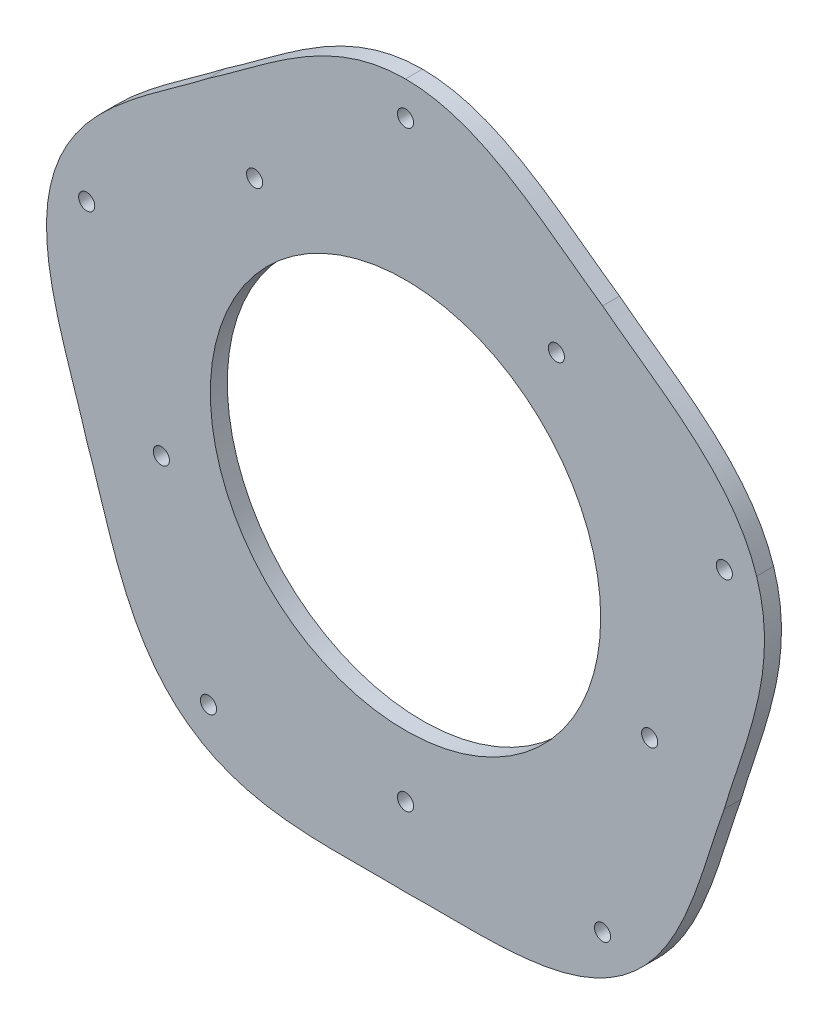
ISO-10303-21;
HEADER;
FILE_DESCRIPTION(('STEP AP214'),'2;1');
FILE_NAME('part.step','',(''),(''),'','','');
FILE_SCHEMA(('AUTOMOTIVE_DESIGN { 1 0 10303 214 1 1 1 1 }'));
ENDSEC;
DATA;
#1=APPLICATION_CONTEXT('core data for automotive mechanical design processes');
#2=APPLICATION_PROTOCOL_DEFINITION('international standard','automotive_design',2000,#1);
#3=PRODUCT_CONTEXT('',#1,'mechanical');
#4=PRODUCT('Part','Part','',(#3));
#5=PRODUCT_RELATED_PRODUCT_CATEGORY('part','',(#4));
#6=PRODUCT_DEFINITION_FORMATION('','',#4);
#7=PRODUCT_DEFINITION_CONTEXT('part definition',#1,'design');
#8=PRODUCT_DEFINITION('design','',#6,#7);
#9=PRODUCT_DEFINITION_SHAPE('','',#8);
#10=(LENGTH_UNIT() NAMED_UNIT(*) SI_UNIT(.MILLI.,.METRE.));
#11=(NAMED_UNIT(*) PLANE_ANGLE_UNIT() SI_UNIT($,.RADIAN.));
#12=(NAMED_UNIT(*) SI_UNIT($,.STERADIAN.) SOLID_ANGLE_UNIT());
#13=UNCERTAINTY_MEASURE_WITH_UNIT(LENGTH_MEASURE(1.E-05),#10,'distance_accuracy_value','');
#14=(GEOMETRIC_REPRESENTATION_CONTEXT(3) GLOBAL_UNCERTAINTY_ASSIGNED_CONTEXT((#13)) GLOBAL_UNIT_ASSIGNED_CONTEXT((#10,
#11,#12)) REPRESENTATION_CONTEXT('',''));
#15=CARTESIAN_POINT('',(0.,0.,0.));
#16=DIRECTION('',(0.,0.,1.));
#17=DIRECTION('',(1.,0.,0.));
#18=AXIS2_PLACEMENT_3D('',#15,#16,#17);
#19=CARTESIAN_POINT('',(0.,87.,4.));
#20=CARTESIAN_POINT('',(18.2248449755487,86.9986126487543,4.));
#21=CARTESIAN_POINT('',(32.2889028746179,73.5369026984063,4.));
#22=CARTESIAN_POINT('',(46.4350349311055,63.9123425556208,4.));
#23=B_SPLINE_CURVE_WITH_KNOTS('',3,(#19,#20,#21,#22),.UNSPECIFIED.,.F.,.F.,(4,4),(0.,1.),.UNSPECIFIED.);
#24=DIRECTION('',(0.,0.,-1.));
#25=VECTOR('',#24,1.);
#26=SURFACE_OF_LINEAR_EXTRUSION('',#23,#25);
#27=CARTESIAN_POINT('',(0.,87.,0.));
#28=CARTESIAN_POINT('',(18.2248449755487,86.9986126487543,0.));
#29=CARTESIAN_POINT('',(32.2889028746179,73.5369026984063,0.));
#30=CARTESIAN_POINT('',(46.4350349311055,63.9123425556208,0.));
#31=B_SPLINE_CURVE_WITH_KNOTS('',3,(#27,#28,#29,#30),.UNSPECIFIED.,.F.,.F.,(4,4),(0.,1.),.UNSPECIFIED.);
#32=CARTESIAN_POINT('',(0.,87.,0.));
#33=VERTEX_POINT('',#32);
#34=CARTESIAN_POINT('',(46.4350349311055,63.9123425556208,0.));
#35=VERTEX_POINT('',#34);
#36=EDGE_CURVE('E288',#33,#35,#31,.T.);
#37=ORIENTED_EDGE('',*,*,#36,.F.);
#38=DIRECTION('',(0.,0.,-1.));
#39=VECTOR('',#38,1.);
#40=CARTESIAN_POINT('',(0.,87.,4.));
#41=LINE('',#40,#39);
#42=CARTESIAN_POINT('',(0.,87.,4.));
#43=VERTEX_POINT('',#42);
#44=EDGE_CURVE('E11',#43,#33,#41,.T.);
#45=ORIENTED_EDGE('',*,*,#44,.F.);
#46=CARTESIAN_POINT('',(46.4350349311055,63.9123425556208,4.));
#47=VERTEX_POINT('',#46);
#48=EDGE_CURVE('E231',#43,#47,#23,.T.);
#49=ORIENTED_EDGE('',*,*,#48,.T.);
#50=DIRECTION('',(0.,0.,-1.));
#51=VECTOR('',#50,1.);
#52=CARTESIAN_POINT('',(46.4350349311055,63.9123425556208,4.));
#53=LINE('',#52,#51);
#54=EDGE_CURVE('E96',#47,#35,#53,.T.);
#55=ORIENTED_EDGE('',*,*,#54,.T.);
#56=EDGE_LOOP('',(#37,#45,#49,#55));
#57=FACE_BOUND('',#56,.T.);
#58=ADVANCED_FACE('F39',(#57),#26,.T.);
#59=CARTESIAN_POINT('',(1.24206200879939E-12,87.,4.));
#60=CARTESIAN_POINT('',(-18.2248449755474,86.9986126487545,4.));
#61=CARTESIAN_POINT('',(-32.2889028746169,73.5369026984067,4.));
#62=CARTESIAN_POINT('',(-46.4350349311046,63.9123425556215,4.));
#63=B_SPLINE_CURVE_WITH_KNOTS('',3,(#59,#60,#61,#62),.UNSPECIFIED.,.F.,.F.,(4,4),(0.,1.),.UNSPECIFIED.);
#64=DIRECTION('',(0.,0.,-1.));
#65=VECTOR('',#64,1.);
#66=SURFACE_OF_LINEAR_EXTRUSION('',#63,#65);
#67=CARTESIAN_POINT('',(1.24206200879939E-12,87.,0.));
#68=CARTESIAN_POINT('',(-18.2248449755474,86.9986126487545,0.));
#69=CARTESIAN_POINT('',(-32.2889028746169,73.5369026984067,0.));
#70=CARTESIAN_POINT('',(-46.4350349311046,63.9123425556215,0.));
#71=B_SPLINE_CURVE_WITH_KNOTS('',3,(#67,#68,#69,#70),.UNSPECIFIED.,.F.,.F.,(4,4),(0.,1.),.UNSPECIFIED.);
#72=CARTESIAN_POINT('',(-46.4350349311046,63.9123425556215,0.));
#73=VERTEX_POINT('',#72);
#74=EDGE_CURVE('E293',#33,#73,#71,.T.);
#75=ORIENTED_EDGE('',*,*,#74,.T.);
#76=DIRECTION('',(0.,0.,-1.));
#77=VECTOR('',#76,1.);
#78=CARTESIAN_POINT('',(-46.4350349311046,63.9123425556215,4.));
#79=LINE('',#78,#77);
#80=CARTESIAN_POINT('',(-46.4350349311046,63.9123425556215,4.));
#81=VERTEX_POINT('',#80);
#82=EDGE_CURVE('E48',#81,#73,#79,.T.);
#83=ORIENTED_EDGE('',*,*,#82,.F.);
#84=EDGE_CURVE('E223',#43,#81,#63,.T.);
#85=ORIENTED_EDGE('',*,*,#84,.F.);
#86=ORIENTED_EDGE('',*,*,#44,.T.);
#87=EDGE_LOOP('',(#75,#83,#85,#86));
#88=FACE_BOUND('',#87,.T.);
#89=ADVANCED_FACE('F214',(#88),#66,.F.);
#90=CARTESIAN_POINT('',(-82.7419169176781,26.8844785106214,4.));
#91=CARTESIAN_POINT('',(-77.1088106509418,44.2169073679737,4.));
#92=CARTESIAN_POINT('',(-59.9599307815023,53.4327241304319,4.));
#93=CARTESIAN_POINT('',(-46.4350349311046,63.9123425556215,4.));
#94=B_SPLINE_CURVE_WITH_KNOTS('',3,(#90,#91,#92,#93),.UNSPECIFIED.,.F.,.F.,(4,4),(0.,1.),.UNSPECIFIED.);
#95=DIRECTION('',(0.,0.,-1.));
#96=VECTOR('',#95,1.);
#97=SURFACE_OF_LINEAR_EXTRUSION('',#94,#96);
#98=CARTESIAN_POINT('',(-82.7419169176781,26.8844785106214,0.));
#99=CARTESIAN_POINT('',(-77.1088106509418,44.2169073679737,0.));
#100=CARTESIAN_POINT('',(-59.9599307815023,53.4327241304319,0.));
#101=CARTESIAN_POINT('',(-46.4350349311046,63.9123425556215,0.));
#102=B_SPLINE_CURVE_WITH_KNOTS('',3,(#98,#99,#100,#101),.UNSPECIFIED.,.F.,.F.,(4,4),(0.,1.),.UNSPECIFIED.);
#103=CARTESIAN_POINT('',(-82.7419169176781,26.8844785106214,0.));
#104=VERTEX_POINT('',#103);
#105=EDGE_CURVE('E301',#104,#73,#102,.T.);
#106=ORIENTED_EDGE('',*,*,#105,.F.);
#107=DIRECTION('',(0.,0.,-1.));
#108=VECTOR('',#107,1.);
#109=CARTESIAN_POINT('',(-82.7419169176781,26.8844785106214,4.));
#110=LINE('',#109,#108);
#111=CARTESIAN_POINT('',(-82.7419169176781,26.8844785106214,4.));
#112=VERTEX_POINT('',#111);
#113=EDGE_CURVE('E393',#112,#104,#110,.T.);
#114=ORIENTED_EDGE('',*,*,#113,.F.);
#115=EDGE_CURVE('E218',#112,#81,#94,.T.);
#116=ORIENTED_EDGE('',*,*,#115,.T.);
#117=ORIENTED_EDGE('',*,*,#82,.T.);
#118=EDGE_LOOP('',(#106,#114,#116,#117));
#119=FACE_BOUND('',#118,.T.);
#120=ADVANCED_FACE('F210',(#119),#97,.T.);
#121=CARTESIAN_POINT('',(-82.7419169176781,26.8844785106214,4.));
#122=CARTESIAN_POINT('',(-88.372384285529,9.55119222304482,4.));
#123=CARTESIAN_POINT('',(-79.915570217461,-7.9844188354213,4.));
#124=CARTESIAN_POINT('',(-75.1334647873174,-24.4123425556201,4.));
#125=B_SPLINE_CURVE_WITH_KNOTS('',3,(#121,#122,#123,#124),.UNSPECIFIED.,.F.,.F.,(4,4),(0.,1.),.UNSPECIFIED.);
#126=DIRECTION('',(0.,0.,-1.));
#127=VECTOR('',#126,1.);
#128=SURFACE_OF_LINEAR_EXTRUSION('',#125,#127);
#129=CARTESIAN_POINT('',(-82.7419169176781,26.8844785106214,0.));
#130=CARTESIAN_POINT('',(-88.372384285529,9.55119222304482,0.));
#131=CARTESIAN_POINT('',(-79.915570217461,-7.9844188354213,0.));
#132=CARTESIAN_POINT('',(-75.1334647873174,-24.4123425556201,0.));
#133=B_SPLINE_CURVE_WITH_KNOTS('',3,(#129,#130,#131,#132),.UNSPECIFIED.,.F.,.F.,(4,4),(0.,1.),.UNSPECIFIED.);
#134=CARTESIAN_POINT('',(-75.1334647873174,-24.4123425556201,0.));
#135=VERTEX_POINT('',#134);
#136=EDGE_CURVE('E309',#104,#135,#133,.T.);
#137=ORIENTED_EDGE('',*,*,#136,.T.);
#138=DIRECTION('',(0.,0.,-1.));
#139=VECTOR('',#138,1.);
#140=CARTESIAN_POINT('',(-75.1334647873174,-24.4123425556201,4.));
#141=LINE('',#140,#139);
#142=CARTESIAN_POINT('',(-75.1334647873174,-24.4123425556201,4.));
#143=VERTEX_POINT('',#142);
#144=EDGE_CURVE('E391',#143,#135,#141,.T.);
#145=ORIENTED_EDGE('',*,*,#144,.F.);
#146=EDGE_CURVE('E195',#112,#143,#125,.T.);
#147=ORIENTED_EDGE('',*,*,#146,.F.);
#148=ORIENTED_EDGE('',*,*,#113,.T.);
#149=EDGE_LOOP('',(#137,#145,#147,#148));
#150=FACE_BOUND('',#149,.T.);
#151=ADVANCED_FACE('F206',(#150),#128,.F.);
#152=CARTESIAN_POINT('',(-51.1373169494458,-70.38447851062,4.));
#153=CARTESIAN_POINT('',(-65.8807107899114,-59.6710610179408,4.));
#154=CARTESIAN_POINT('',(-69.3461780606782,-40.5136630743026,4.));
#155=CARTESIAN_POINT('',(-75.1334647873174,-24.4123425556201,4.));
#156=B_SPLINE_CURVE_WITH_KNOTS('',3,(#152,#153,#154,#155),.UNSPECIFIED.,.F.,.F.,(4,4),(0.,1.),.UNSPECIFIED.);
#157=DIRECTION('',(0.,0.,-1.));
#158=VECTOR('',#157,1.);
#159=SURFACE_OF_LINEAR_EXTRUSION('',#156,#158);
#160=CARTESIAN_POINT('',(-51.1373169494458,-70.38447851062,0.));
#161=CARTESIAN_POINT('',(-65.8807107899114,-59.6710610179408,0.));
#162=CARTESIAN_POINT('',(-69.3461780606782,-40.5136630743026,0.));
#163=CARTESIAN_POINT('',(-75.1334647873174,-24.4123425556201,0.));
#164=B_SPLINE_CURVE_WITH_KNOTS('',3,(#160,#161,#162,#163),.UNSPECIFIED.,.F.,.F.,(4,4),(0.,1.),.UNSPECIFIED.);
#165=CARTESIAN_POINT('',(-51.1373169494458,-70.38447851062,0.));
#166=VERTEX_POINT('',#165);
#167=EDGE_CURVE('E317',#166,#135,#164,.T.);
#168=ORIENTED_EDGE('',*,*,#167,.F.);
#169=DIRECTION('',(0.,0.,-1.));
#170=VECTOR('',#169,1.);
#171=CARTESIAN_POINT('',(-51.1373169494458,-70.38447851062,4.));
#172=LINE('',#171,#170);
#173=CARTESIAN_POINT('',(-51.1373169494458,-70.38447851062,4.));
#174=VERTEX_POINT('',#173);
#175=EDGE_CURVE('E389',#174,#166,#172,.T.);
#176=ORIENTED_EDGE('',*,*,#175,.F.);
#177=EDGE_CURVE('E186',#174,#143,#156,.T.);
#178=ORIENTED_EDGE('',*,*,#177,.T.);
#179=ORIENTED_EDGE('',*,*,#144,.T.);
#180=EDGE_LOOP('',(#168,#176,#178,#179));
#181=FACE_BOUND('',#180,.T.);
#182=ADVANCED_FACE('F203',(#181),#159,.T.);
#183=CARTESIAN_POINT('',(-51.1373169494458,-70.38447851062,4.));
#184=CARTESIAN_POINT('',(-36.3922921797762,-81.0956512218293,4.));
#185=CARTESIAN_POINT('',(-17.1016357501025,-78.4715449191119,4.));
#186=CARTESIAN_POINT('',(-5.68989300120393E-13,-79.,4.));
#187=B_SPLINE_CURVE_WITH_KNOTS('',3,(#183,#184,#185,#186),.UNSPECIFIED.,.F.,.F.,(4,4),(0.,1.),.UNSPECIFIED.);
#188=DIRECTION('',(0.,0.,-1.));
#189=VECTOR('',#188,1.);
#190=SURFACE_OF_LINEAR_EXTRUSION('',#187,#189);
#191=CARTESIAN_POINT('',(-51.1373169494458,-70.38447851062,0.));
#192=CARTESIAN_POINT('',(-36.3922921797762,-81.0956512218293,0.));
#193=CARTESIAN_POINT('',(-17.1016357501025,-78.4715449191119,0.));
#194=CARTESIAN_POINT('',(-5.68989300120393E-13,-79.,0.));
#195=B_SPLINE_CURVE_WITH_KNOTS('',3,(#191,#192,#193,#194),.UNSPECIFIED.,.F.,.F.,(4,4),(0.,1.),.UNSPECIFIED.);
#196=CARTESIAN_POINT('',(-5.68989300120393E-13,-79.,0.));
#197=VERTEX_POINT('',#196);
#198=EDGE_CURVE('E325',#166,#197,#195,.T.);
#199=ORIENTED_EDGE('',*,*,#198,.T.);
#200=DIRECTION('',(0.,0.,-1.));
#201=VECTOR('',#200,1.);
#202=CARTESIAN_POINT('',(-5.68989300120393E-13,-79.,4.));
#203=LINE('',#202,#201);
#204=CARTESIAN_POINT('',(-5.68989300120393E-13,-79.,4.));
#205=VERTEX_POINT('',#204);
#206=EDGE_CURVE('E387',#205,#197,#203,.T.);
#207=ORIENTED_EDGE('',*,*,#206,.F.);
#208=EDGE_CURVE('E178',#174,#205,#187,.T.);
#209=ORIENTED_EDGE('',*,*,#208,.F.);
#210=ORIENTED_EDGE('',*,*,#175,.T.);
#211=EDGE_LOOP('',(#199,#207,#209,#210));
#212=FACE_BOUND('',#211,.T.);
#213=ADVANCED_FACE('F171',(#212),#190,.F.);
#214=CARTESIAN_POINT('',(51.1373169494448,-70.3844785106207,4.));
#215=CARTESIAN_POINT('',(36.392292179775,-81.0956512218298,4.));
#216=CARTESIAN_POINT('',(17.1016357501013,-78.4715449191122,4.));
#217=CARTESIAN_POINT('',(-5.68989300120393E-13,-79.,4.));
#218=B_SPLINE_CURVE_WITH_KNOTS('',3,(#214,#215,#216,#217),.UNSPECIFIED.,.F.,.F.,(4,4),(0.,1.),.UNSPECIFIED.);
#219=DIRECTION('',(0.,0.,-1.));
#220=VECTOR('',#219,1.);
#221=SURFACE_OF_LINEAR_EXTRUSION('',#218,#220);
#222=CARTESIAN_POINT('',(51.1373169494448,-70.3844785106207,0.));
#223=CARTESIAN_POINT('',(36.392292179775,-81.0956512218298,0.));
#224=CARTESIAN_POINT('',(17.1016357501013,-78.4715449191122,0.));
#225=CARTESIAN_POINT('',(-5.68989300120393E-13,-79.,0.));
#226=B_SPLINE_CURVE_WITH_KNOTS('',3,(#222,#223,#224,#225),.UNSPECIFIED.,.F.,.F.,(4,4),(0.,1.),.UNSPECIFIED.);
#227=CARTESIAN_POINT('',(51.1373169494448,-70.3844785106207,0.));
#228=VERTEX_POINT('',#227);
#229=EDGE_CURVE('E333',#228,#197,#226,.T.);
#230=ORIENTED_EDGE('',*,*,#229,.F.);
#231=DIRECTION('',(0.,0.,-1.));
#232=VECTOR('',#231,1.);
#233=CARTESIAN_POINT('',(51.1373169494448,-70.3844785106207,4.));
#234=LINE('',#233,#232);
#235=CARTESIAN_POINT('',(51.1373169494448,-70.3844785106207,4.));
#236=VERTEX_POINT('',#235);
#237=EDGE_CURVE('E139',#236,#228,#234,.T.);
#238=ORIENTED_EDGE('',*,*,#237,.F.);
#239=EDGE_CURVE('E128',#236,#205,#218,.T.);
#240=ORIENTED_EDGE('',*,*,#239,.T.);
#241=ORIENTED_EDGE('',*,*,#206,.T.);
#242=EDGE_LOOP('',(#230,#238,#240,#241));
#243=FACE_BOUND('',#242,.T.);
#244=ADVANCED_FACE('F168',(#243),#221,.T.);
#245=CARTESIAN_POINT('',(51.1373169494448,-70.3844785106207,4.));
#246=CARTESIAN_POINT('',(65.8807107899106,-59.6710610179418,4.));
#247=CARTESIAN_POINT('',(69.3461780606775,-40.5136630743036,4.));
#248=CARTESIAN_POINT('',(75.1334647873171,-24.4123425556212,4.));
#249=B_SPLINE_CURVE_WITH_KNOTS('',3,(#245,#246,#247,#248),.UNSPECIFIED.,.F.,.F.,(4,4),(0.,1.),.UNSPECIFIED.);
#250=DIRECTION('',(0.,0.,-1.));
#251=VECTOR('',#250,1.);
#252=SURFACE_OF_LINEAR_EXTRUSION('',#249,#251);
#253=CARTESIAN_POINT('',(51.1373169494448,-70.3844785106207,0.));
#254=CARTESIAN_POINT('',(65.8807107899106,-59.6710610179418,0.));
#255=CARTESIAN_POINT('',(69.3461780606775,-40.5136630743036,0.));
#256=CARTESIAN_POINT('',(75.1334647873171,-24.4123425556212,0.));
#257=B_SPLINE_CURVE_WITH_KNOTS('',3,(#253,#254,#255,#256),.UNSPECIFIED.,.F.,.F.,(4,4),(0.,1.),.UNSPECIFIED.);
#258=CARTESIAN_POINT('',(75.1334647873171,-24.4123425556212,0.));
#259=VERTEX_POINT('',#258);
#260=EDGE_CURVE('E135',#228,#259,#257,.T.);
#261=ORIENTED_EDGE('',*,*,#260,.T.);
#262=DIRECTION('',(0.,0.,-1.));
#263=VECTOR('',#262,1.);
#264=CARTESIAN_POINT('',(75.1334647873171,-24.4123425556212,4.));
#265=LINE('',#264,#263);
#266=CARTESIAN_POINT('',(75.1334647873171,-24.4123425556212,4.));
#267=VERTEX_POINT('',#266);
#268=EDGE_CURVE('E132',#267,#259,#265,.T.);
#269=ORIENTED_EDGE('',*,*,#268,.F.);
#270=EDGE_CURVE('E121',#236,#267,#249,.T.);
#271=ORIENTED_EDGE('',*,*,#270,.F.);
#272=ORIENTED_EDGE('',*,*,#237,.T.);
#273=EDGE_LOOP('',(#261,#269,#271,#272));
#274=FACE_BOUND('',#273,.T.);
#275=ADVANCED_FACE('F133',(#274),#252,.F.);
#276=CARTESIAN_POINT('',(82.7419169176785,26.8844785106202,4.));
#277=CARTESIAN_POINT('',(88.3723842855293,9.55119222304353,4.));
#278=CARTESIAN_POINT('',(79.915570217461,-7.98441883542246,4.));
#279=CARTESIAN_POINT('',(75.1334647873171,-24.4123425556212,4.));
#280=B_SPLINE_CURVE_WITH_KNOTS('',3,(#276,#277,#278,#279),.UNSPECIFIED.,.F.,.F.,(4,4),(0.,1.),.UNSPECIFIED.);
#281=DIRECTION('',(0.,0.,-1.));
#282=VECTOR('',#281,1.);
#283=SURFACE_OF_LINEAR_EXTRUSION('',#280,#282);
#284=CARTESIAN_POINT('',(82.7419169176785,26.8844785106202,0.));
#285=CARTESIAN_POINT('',(88.3723842855293,9.55119222304353,0.));
#286=CARTESIAN_POINT('',(79.915570217461,-7.98441883542246,0.));
#287=CARTESIAN_POINT('',(75.1334647873171,-24.4123425556212,0.));
#288=B_SPLINE_CURVE_WITH_KNOTS('',3,(#284,#285,#286,#287),.UNSPECIFIED.,.F.,.F.,(4,4),(0.,1.),.UNSPECIFIED.);
#289=CARTESIAN_POINT('',(82.7419169176785,26.8844785106202,0.));
#290=VERTEX_POINT('',#289);
#291=EDGE_CURVE('E347',#290,#259,#288,.T.);
#292=ORIENTED_EDGE('',*,*,#291,.F.);
#293=DIRECTION('',(0.,0.,-1.));
#294=VECTOR('',#293,1.);
#295=CARTESIAN_POINT('',(82.7419169176785,26.8844785106202,4.));
#296=LINE('',#295,#294);
#297=CARTESIAN_POINT('',(82.7419169176785,26.8844785106202,4.));
#298=VERTEX_POINT('',#297);
#299=EDGE_CURVE('E89',#298,#290,#296,.T.);
#300=ORIENTED_EDGE('',*,*,#299,.F.);
#301=EDGE_CURVE('E126',#298,#267,#280,.T.);
#302=ORIENTED_EDGE('',*,*,#301,.T.);
#303=ORIENTED_EDGE('',*,*,#268,.T.);
#304=EDGE_LOOP('',(#292,#300,#302,#303));
#305=FACE_BOUND('',#304,.T.);
#306=ADVANCED_FACE('F141',(#305),#283,.T.);
#307=CARTESIAN_POINT('',(35.5610077636947,48.9455281596843,4.));
#308=DIRECTION('',(0.,0.,-1.));
#309=DIRECTION('',(-1.,0.,0.));
#310=AXIS2_PLACEMENT_3D('',#307,#308,#309);
#311=CYLINDRICAL_SURFACE('',#310,1.9);
#312=CARTESIAN_POINT('',(35.5610077636947,48.9455281596843,4.));
#313=DIRECTION('',(0.,0.,1.));
#314=DIRECTION('',(1.,0.,0.));
#315=AXIS2_PLACEMENT_3D('',#312,#313,#314);
#316=CIRCLE('',#315,1.9);
#317=CARTESIAN_POINT('',(37.4610077636947,48.9455281596843,4.));
#318=VERTEX_POINT('',#317);
#319=EDGE_CURVE('E626',#318,#318,#316,.T.);
#320=ORIENTED_EDGE('',*,*,#319,.T.);
#321=EDGE_LOOP('',(#320));
#322=FACE_BOUND('',#321,.T.);
#323=CARTESIAN_POINT('',(35.5610077636947,48.9455281596843,0.));
#324=DIRECTION('',(0.,0.,1.));
#325=DIRECTION('',(1.,0.,0.));
#326=AXIS2_PLACEMENT_3D('',#323,#324,#325);
#327=CIRCLE('',#326,1.9);
#328=CARTESIAN_POINT('',(37.4610077636947,48.9455281596843,0.));
#329=VERTEX_POINT('',#328);
#330=EDGE_CURVE('E376',#329,#329,#327,.T.);
#331=ORIENTED_EDGE('',*,*,#330,.F.);
#332=EDGE_LOOP('',(#331));
#333=FACE_BOUND('',#332,.T.);
#334=ADVANCED_FACE('F163',(#322,#333),#311,.F.);
#335=CARTESIAN_POINT('',(57.538919235858,-18.6955281596827,4.));
#336=DIRECTION('',(0.,0.,-1.));
#337=DIRECTION('',(-1.,0.,0.));
#338=AXIS2_PLACEMENT_3D('',#335,#336,#337);
#339=CYLINDRICAL_SURFACE('',#338,1.90000000000002);
#340=CARTESIAN_POINT('',(57.538919235858,-18.6955281596827,4.));
#341=DIRECTION('',(0.,0.,1.));
#342=DIRECTION('',(1.,0.,0.));
#343=AXIS2_PLACEMENT_3D('',#340,#341,#342);
#344=CIRCLE('',#343,1.90000000000002);
#345=CARTESIAN_POINT('',(59.438919235858,-18.6955281596827,4.));
#346=VERTEX_POINT('',#345);
#347=EDGE_CURVE('E628',#346,#346,#344,.T.);
#348=ORIENTED_EDGE('',*,*,#347,.T.);
#349=EDGE_LOOP('',(#348));
#350=FACE_BOUND('',#349,.T.);
#351=CARTESIAN_POINT('',(57.538919235858,-18.6955281596827,0.));
#352=DIRECTION('',(0.,0.,1.));
#353=DIRECTION('',(1.,0.,0.));
#354=AXIS2_PLACEMENT_3D('',#351,#352,#353);
#355=CIRCLE('',#354,1.90000000000002);
#356=CARTESIAN_POINT('',(59.438919235858,-18.6955281596827,0.));
#357=VERTEX_POINT('',#356);
#358=EDGE_CURVE('E373',#357,#357,#355,.T.);
#359=ORIENTED_EDGE('',*,*,#358,.F.);
#360=EDGE_LOOP('',(#359));
#361=FACE_BOUND('',#360,.T.);
#362=ADVANCED_FACE('F426',(#350,#361),#339,.F.);
#363=CARTESIAN_POINT('',(3.08410264398045E-12,-60.499999999999,4.));
#364=DIRECTION('',(0.,0.,-1.));
#365=DIRECTION('',(-1.,0.,0.));
#366=AXIS2_PLACEMENT_3D('',#363,#364,#365);
#367=CYLINDRICAL_SURFACE('',#366,1.9);
#368=CARTESIAN_POINT('',(3.08410264398045E-12,-60.499999999999,4.));
#369=DIRECTION('',(0.,0.,1.));
#370=DIRECTION('',(1.,0.,0.));
#371=AXIS2_PLACEMENT_3D('',#368,#369,#370);
#372=CIRCLE('',#371,1.9);
#373=CARTESIAN_POINT('',(1.90000000000308,-60.499999999999,4.));
#374=VERTEX_POINT('',#373);
#375=EDGE_CURVE('E633',#374,#374,#372,.T.);
#376=ORIENTED_EDGE('',*,*,#375,.T.);
#377=EDGE_LOOP('',(#376));
#378=FACE_BOUND('',#377,.T.);
#379=CARTESIAN_POINT('',(3.08410264398045E-12,-60.499999999999,0.));
#380=DIRECTION('',(0.,0.,1.));
#381=DIRECTION('',(1.,0.,0.));
#382=AXIS2_PLACEMENT_3D('',#379,#380,#381);
#383=CIRCLE('',#382,1.9);
#384=CARTESIAN_POINT('',(1.90000000000308,-60.499999999999,0.));
#385=VERTEX_POINT('',#384);
#386=EDGE_CURVE('E370',#385,#385,#383,.T.);
#387=ORIENTED_EDGE('',*,*,#386,.F.);
#388=EDGE_LOOP('',(#387));
#389=FACE_BOUND('',#388,.T.);
#390=ADVANCED_FACE('F418',(#378,#389),#367,.F.);
#391=CARTESIAN_POINT('',(-57.5389192358537,-18.6955281596853,4.));
#392=DIRECTION('',(0.,0.,-1.));
#393=DIRECTION('',(-1.,0.,0.));
#394=AXIS2_PLACEMENT_3D('',#391,#392,#393);
#395=CYLINDRICAL_SURFACE('',#394,1.90000000000002);
#396=CARTESIAN_POINT('',(-57.5389192358537,-18.6955281596853,4.));
#397=DIRECTION('',(0.,0.,1.));
#398=DIRECTION('',(1.,0.,0.));
#399=AXIS2_PLACEMENT_3D('',#396,#397,#398);
#400=CIRCLE('',#399,1.90000000000002);
#401=CARTESIAN_POINT('',(-55.6389192358536,-18.6955281596853,4.));
#402=VERTEX_POINT('',#401);
#403=EDGE_CURVE('E636',#402,#402,#400,.T.);
#404=ORIENTED_EDGE('',*,*,#403,.T.);
#405=EDGE_LOOP('',(#404));
#406=FACE_BOUND('',#405,.T.);
#407=CARTESIAN_POINT('',(-57.5389192358537,-18.6955281596853,0.));
#408=DIRECTION('',(0.,0.,1.));
#409=DIRECTION('',(1.,0.,0.));
#410=AXIS2_PLACEMENT_3D('',#407,#408,#409);
#411=CIRCLE('',#410,1.90000000000002);
#412=CARTESIAN_POINT('',(-55.6389192358536,-18.6955281596853,0.));
#413=VERTEX_POINT('',#412);
#414=EDGE_CURVE('E367',#413,#413,#411,.T.);
#415=ORIENTED_EDGE('',*,*,#414,.F.);
#416=EDGE_LOOP('',(#415));
#417=FACE_BOUND('',#416,.T.);
#418=ADVANCED_FACE('F413',(#406,#417),#395,.F.);
#419=CARTESIAN_POINT('',(-35.5610077636933,48.9455281596827,4.));
#420=DIRECTION('',(0.,0.,-1.));
#421=DIRECTION('',(-1.,0.,0.));
#422=AXIS2_PLACEMENT_3D('',#419,#420,#421);
#423=CYLINDRICAL_SURFACE('',#422,1.90000000000002);
#424=CARTESIAN_POINT('',(-35.5610077636933,48.9455281596827,4.));
#425=DIRECTION('',(0.,0.,1.));
#426=DIRECTION('',(1.,0.,0.));
#427=AXIS2_PLACEMENT_3D('',#424,#425,#426);
#428=CIRCLE('',#427,1.90000000000002);
#429=CARTESIAN_POINT('',(-33.6610077636933,48.9455281596827,4.));
#430=VERTEX_POINT('',#429);
#431=EDGE_CURVE('E143',#430,#430,#428,.T.);
#432=ORIENTED_EDGE('',*,*,#431,.T.);
#433=EDGE_LOOP('',(#432));
#434=FACE_BOUND('',#433,.T.);
#435=CARTESIAN_POINT('',(-35.5610077636933,48.9455281596827,0.));
#436=DIRECTION('',(0.,0.,1.));
#437=DIRECTION('',(1.,0.,0.));
#438=AXIS2_PLACEMENT_3D('',#435,#436,#437);
#439=CIRCLE('',#438,1.90000000000002);
#440=CARTESIAN_POINT('',(-33.6610077636933,48.9455281596827,0.));
#441=VERTEX_POINT('',#440);
#442=EDGE_CURVE('E361',#441,#441,#439,.T.);
#443=ORIENTED_EDGE('',*,*,#442,.F.);
#444=EDGE_LOOP('',(#443));
#445=FACE_BOUND('',#444,.T.);
#446=ADVANCED_FACE('F409',(#434,#445),#423,.F.);
#447=CARTESIAN_POINT('',(82.7419169176785,26.8844785106202,4.));
#448=CARTESIAN_POINT('',(77.1088106509424,44.2169073679726,4.));
#449=CARTESIAN_POINT('',(59.9599307815031,53.432724130431,4.));
#450=CARTESIAN_POINT('',(46.4350349311055,63.9123425556208,4.));
#451=B_SPLINE_CURVE_WITH_KNOTS('',3,(#447,#448,#449,#450),.UNSPECIFIED.,.F.,.F.,(4,4),(0.,1.),.UNSPECIFIED.);
#452=DIRECTION('',(0.,0.,-1.));
#453=VECTOR('',#452,1.);
#454=SURFACE_OF_LINEAR_EXTRUSION('',#451,#453);
#455=CARTESIAN_POINT('',(82.7419169176785,26.8844785106202,0.));
#456=CARTESIAN_POINT('',(77.1088106509424,44.2169073679726,0.));
#457=CARTESIAN_POINT('',(59.9599307815031,53.432724130431,0.));
#458=CARTESIAN_POINT('',(46.4350349311055,63.9123425556208,0.));
#459=B_SPLINE_CURVE_WITH_KNOTS('',3,(#455,#456,#457,#458),.UNSPECIFIED.,.F.,.F.,(4,4),(0.,1.),.UNSPECIFIED.);
#460=EDGE_CURVE('E354',#290,#35,#459,.T.);
#461=ORIENTED_EDGE('',*,*,#460,.T.);
#462=ORIENTED_EDGE('',*,*,#54,.F.);
#463=EDGE_CURVE('E56',#298,#47,#451,.T.);
#464=ORIENTED_EDGE('',*,*,#463,.F.);
#465=ORIENTED_EDGE('',*,*,#299,.T.);
#466=EDGE_LOOP('',(#461,#462,#464,#465));
#467=FACE_BOUND('',#466,.T.);
#468=ADVANCED_FACE('F164',(#467),#454,.F.);
#469=CARTESIAN_POINT('',(-75.1334647873156,24.4123425556187,4.));
#470=DIRECTION('',(0.,0.,-1.));
#471=DIRECTION('',(-1.,0.,0.));
#472=AXIS2_PLACEMENT_3D('',#469,#470,#471);
#473=CYLINDRICAL_SURFACE('',#472,1.90000000000296);
#474=CARTESIAN_POINT('',(-75.1334647873156,24.4123425556187,4.));
#475=DIRECTION('',(0.,0.,1.));
#476=DIRECTION('',(1.,0.,0.));
#477=AXIS2_PLACEMENT_3D('',#474,#475,#476);
#478=CIRCLE('',#477,1.90000000000296);
#479=CARTESIAN_POINT('',(-73.2334647873126,24.4123425556187,4.));
#480=VERTEX_POINT('',#479);
#481=EDGE_CURVE('E239',#480,#480,#478,.T.);
#482=ORIENTED_EDGE('',*,*,#481,.T.);
#483=EDGE_LOOP('',(#482));
#484=FACE_BOUND('',#483,.T.);
#485=CARTESIAN_POINT('',(-75.1334647873156,24.4123425556187,0.));
#486=DIRECTION('',(0.,0.,1.));
#487=DIRECTION('',(1.,0.,0.));
#488=AXIS2_PLACEMENT_3D('',#485,#486,#487);
#489=CIRCLE('',#488,1.90000000000296);
#490=CARTESIAN_POINT('',(-73.2334647873126,24.4123425556187,0.));
#491=VERTEX_POINT('',#490);
#492=EDGE_CURVE('E285',#491,#491,#489,.T.);
#493=ORIENTED_EDGE('',*,*,#492,.F.);
#494=EDGE_LOOP('',(#493));
#495=FACE_BOUND('',#494,.T.);
#496=ADVANCED_FACE('F246',(#484,#495),#473,.F.);
#497=CARTESIAN_POINT('',(-46.4350349311014,-63.9123425556222,4.));
#498=DIRECTION('',(0.,0.,-1.));
#499=DIRECTION('',(-1.,0.,0.));
#500=AXIS2_PLACEMENT_3D('',#497,#498,#499);
#501=CYLINDRICAL_SURFACE('',#500,1.90000000000488);
#502=CARTESIAN_POINT('',(-46.4350349311014,-63.9123425556222,4.));
#503=DIRECTION('',(0.,0.,1.));
#504=DIRECTION('',(1.,0.,0.));
#505=AXIS2_PLACEMENT_3D('',#502,#503,#504);
#506=CIRCLE('',#505,1.90000000000488);
#507=CARTESIAN_POINT('',(-44.5350349310965,-63.9123425556222,4.));
#508=VERTEX_POINT('',#507);
#509=EDGE_CURVE('E455',#508,#508,#506,.T.);
#510=ORIENTED_EDGE('',*,*,#509,.T.);
#511=EDGE_LOOP('',(#510));
#512=FACE_BOUND('',#511,.T.);
#513=CARTESIAN_POINT('',(-46.4350349311014,-63.9123425556222,0.));
#514=DIRECTION('',(0.,0.,1.));
#515=DIRECTION('',(1.,0.,0.));
#516=AXIS2_PLACEMENT_3D('',#513,#514,#515);
#517=CIRCLE('',#516,1.90000000000488);
#518=CARTESIAN_POINT('',(-44.5350349310965,-63.9123425556222,0.));
#519=VERTEX_POINT('',#518);
#520=EDGE_CURVE('E277',#519,#519,#517,.T.);
#521=ORIENTED_EDGE('',*,*,#520,.F.);
#522=EDGE_LOOP('',(#521));
#523=FACE_BOUND('',#522,.T.);
#524=ADVANCED_FACE('F249',(#512,#523),#501,.F.);
#525=CARTESIAN_POINT('',(46.4350349311094,-63.9123425556195,4.));
#526=DIRECTION('',(0.,0.,-1.));
#527=DIRECTION('',(-1.,0.,0.));
#528=AXIS2_PLACEMENT_3D('',#525,#526,#527);
#529=CYLINDRICAL_SURFACE('',#528,1.90000000000389);
#530=CARTESIAN_POINT('',(46.4350349311094,-63.9123425556195,4.));
#531=DIRECTION('',(0.,0.,1.));
#532=DIRECTION('',(1.,0.,0.));
#533=AXIS2_PLACEMENT_3D('',#530,#531,#532);
#534=CIRCLE('',#533,1.90000000000389);
#535=CARTESIAN_POINT('',(48.3350349311133,-63.9123425556195,4.));
#536=VERTEX_POINT('',#535);
#537=EDGE_CURVE('E451',#536,#536,#534,.T.);
#538=ORIENTED_EDGE('',*,*,#537,.T.);
#539=EDGE_LOOP('',(#538));
#540=FACE_BOUND('',#539,.T.);
#541=CARTESIAN_POINT('',(46.4350349311094,-63.9123425556195,0.));
#542=DIRECTION('',(0.,0.,1.));
#543=DIRECTION('',(1.,0.,0.));
#544=AXIS2_PLACEMENT_3D('',#541,#542,#543);
#545=CIRCLE('',#544,1.90000000000389);
#546=CARTESIAN_POINT('',(48.3350349311133,-63.9123425556195,0.));
#547=VERTEX_POINT('',#546);
#548=EDGE_CURVE('E273',#547,#547,#545,.T.);
#549=ORIENTED_EDGE('',*,*,#548,.F.);
#550=EDGE_LOOP('',(#549));
#551=FACE_BOUND('',#550,.T.);
#552=ADVANCED_FACE('F253',(#540,#551),#529,.F.);
#553=CARTESIAN_POINT('',(75.1334647873187,24.412342555623,4.));
#554=DIRECTION('',(0.,0.,-1.));
#555=DIRECTION('',(-1.,0.,0.));
#556=AXIS2_PLACEMENT_3D('',#553,#554,#555);
#557=CYLINDRICAL_SURFACE('',#556,1.90000000000108);
#558=CARTESIAN_POINT('',(75.1334647873187,24.412342555623,4.));
#559=DIRECTION('',(0.,0.,1.));
#560=DIRECTION('',(1.,0.,0.));
#561=AXIS2_PLACEMENT_3D('',#558,#559,#560);
#562=CIRCLE('',#561,1.90000000000108);
#563=CARTESIAN_POINT('',(77.0334647873198,24.412342555623,4.));
#564=VERTEX_POINT('',#563);
#565=EDGE_CURVE('E268',#564,#564,#562,.T.);
#566=ORIENTED_EDGE('',*,*,#565,.T.);
#567=EDGE_LOOP('',(#566));
#568=FACE_BOUND('',#567,.T.);
#569=CARTESIAN_POINT('',(75.1334647873187,24.412342555623,0.));
#570=DIRECTION('',(0.,0.,1.));
#571=DIRECTION('',(1.,0.,0.));
#572=AXIS2_PLACEMENT_3D('',#569,#570,#571);
#573=CIRCLE('',#572,1.90000000000108);
#574=CARTESIAN_POINT('',(77.0334647873198,24.412342555623,0.));
#575=VERTEX_POINT('',#574);
#576=EDGE_CURVE('E271',#575,#575,#573,.T.);
#577=ORIENTED_EDGE('',*,*,#576,.F.);
#578=EDGE_LOOP('',(#577));
#579=FACE_BOUND('',#578,.T.);
#580=ADVANCED_FACE('F256',(#568,#579),#557,.F.);
#581=CARTESIAN_POINT('',(0.,79.,4.));
#582=DIRECTION('',(0.,0.,-1.));
#583=DIRECTION('',(-1.,0.,0.));
#584=AXIS2_PLACEMENT_3D('',#581,#582,#583);
#585=CYLINDRICAL_SURFACE('',#584,1.9);
#586=CARTESIAN_POINT('',(0.,79.,4.));
#587=DIRECTION('',(0.,0.,1.));
#588=DIRECTION('',(1.,0.,0.));
#589=AXIS2_PLACEMENT_3D('',#586,#587,#588);
#590=CIRCLE('',#589,1.9);
#591=CARTESIAN_POINT('',(1.9,79.,4.));
#592=VERTEX_POINT('',#591);
#593=EDGE_CURVE('E382',#592,#592,#590,.T.);
#594=ORIENTED_EDGE('',*,*,#593,.T.);
#595=EDGE_LOOP('',(#594));
#596=FACE_BOUND('',#595,.T.);
#597=CARTESIAN_POINT('',(0.,79.,0.));
#598=DIRECTION('',(0.,0.,1.));
#599=DIRECTION('',(1.,0.,0.));
#600=AXIS2_PLACEMENT_3D('',#597,#598,#599);
#601=CIRCLE('',#600,1.9);
#602=CARTESIAN_POINT('',(1.9,79.,0.));
#603=VERTEX_POINT('',#602);
#604=EDGE_CURVE('E274',#603,#603,#601,.T.);
#605=ORIENTED_EDGE('',*,*,#604,.F.);
#606=EDGE_LOOP('',(#605));
#607=FACE_BOUND('',#606,.T.);
#608=ADVANCED_FACE('F41',(#596,#607),#585,.F.);
#609=CARTESIAN_POINT('',(0.,0.,4.));
#610=DIRECTION('',(0.,0.,-1.));
#611=DIRECTION('',(-1.,0.,0.));
#612=AXIS2_PLACEMENT_3D('',#609,#610,#611);
#613=CYLINDRICAL_SURFACE('',#612,46.);
#614=CARTESIAN_POINT('',(0.,0.,4.));
#615=DIRECTION('',(0.,0.,1.));
#616=DIRECTION('',(1.,0.,0.));
#617=AXIS2_PLACEMENT_3D('',#614,#615,#616);
#618=CIRCLE('',#617,46.);
#619=CARTESIAN_POINT('',(46.,0.,4.));
#620=VERTEX_POINT('',#619);
#621=EDGE_CURVE('E384',#620,#620,#618,.T.);
#622=ORIENTED_EDGE('',*,*,#621,.T.);
#623=EDGE_LOOP('',(#622));
#624=FACE_BOUND('',#623,.T.);
#625=CARTESIAN_POINT('',(0.,0.,0.));
#626=DIRECTION('',(0.,0.,1.));
#627=DIRECTION('',(1.,0.,0.));
#628=AXIS2_PLACEMENT_3D('',#625,#626,#627);
#629=CIRCLE('',#628,46.);
#630=CARTESIAN_POINT('',(46.,0.,0.));
#631=VERTEX_POINT('',#630);
#632=EDGE_CURVE('E379',#631,#631,#629,.T.);
#633=ORIENTED_EDGE('',*,*,#632,.F.);
#634=EDGE_LOOP('',(#633));
#635=FACE_BOUND('',#634,.T.);
#636=ADVANCED_FACE('F263',(#624,#635),#613,.F.);
#637=CARTESIAN_POINT('',(0.,0.,4.));
#638=DIRECTION('',(0.,0.,1.));
#639=DIRECTION('',(1.,0.,0.));
#640=AXIS2_PLACEMENT_3D('',#637,#638,#639);
#641=PLANE('',#640);
#642=ORIENTED_EDGE('',*,*,#593,.F.);
#643=EDGE_LOOP('',(#642));
#644=FACE_BOUND('',#643,.T.);
#645=ORIENTED_EDGE('',*,*,#565,.F.);
#646=EDGE_LOOP('',(#645));
#647=FACE_BOUND('',#646,.T.);
#648=ORIENTED_EDGE('',*,*,#537,.F.);
#649=EDGE_LOOP('',(#648));
#650=FACE_BOUND('',#649,.T.);
#651=ORIENTED_EDGE('',*,*,#509,.F.);
#652=EDGE_LOOP('',(#651));
#653=FACE_BOUND('',#652,.T.);
#654=ORIENTED_EDGE('',*,*,#481,.F.);
#655=EDGE_LOOP('',(#654));
#656=FACE_BOUND('',#655,.T.);
#657=ORIENTED_EDGE('',*,*,#48,.F.);
#658=ORIENTED_EDGE('',*,*,#84,.T.);
#659=ORIENTED_EDGE('',*,*,#115,.F.);
#660=ORIENTED_EDGE('',*,*,#146,.T.);
#661=ORIENTED_EDGE('',*,*,#177,.F.);
#662=ORIENTED_EDGE('',*,*,#208,.T.);
#663=ORIENTED_EDGE('',*,*,#239,.F.);
#664=ORIENTED_EDGE('',*,*,#270,.T.);
#665=ORIENTED_EDGE('',*,*,#301,.F.);
#666=ORIENTED_EDGE('',*,*,#463,.T.);
#667=EDGE_LOOP('',(#657,#658,#659,#660,#661,#662,#663,#664,#665,#666));
#668=FACE_BOUND('',#667,.T.);
#669=ORIENTED_EDGE('',*,*,#431,.F.);
#670=EDGE_LOOP('',(#669));
#671=FACE_BOUND('',#670,.T.);
#672=ORIENTED_EDGE('',*,*,#403,.F.);
#673=EDGE_LOOP('',(#672));
#674=FACE_BOUND('',#673,.T.);
#675=ORIENTED_EDGE('',*,*,#375,.F.);
#676=EDGE_LOOP('',(#675));
#677=FACE_BOUND('',#676,.T.);
#678=ORIENTED_EDGE('',*,*,#347,.F.);
#679=EDGE_LOOP('',(#678));
#680=FACE_BOUND('',#679,.T.);
#681=ORIENTED_EDGE('',*,*,#319,.F.);
#682=EDGE_LOOP('',(#681));
#683=FACE_BOUND('',#682,.T.);
#684=ORIENTED_EDGE('',*,*,#621,.F.);
#685=EDGE_LOOP('',(#684));
#686=FACE_BOUND('',#685,.T.);
#687=ADVANCED_FACE('F123',(#644,#647,#650,#653,#656,#668,#671,#674,#677,#680,#683,#686),#641,.T.);
#688=CARTESIAN_POINT('',(0.,0.,0.));
#689=DIRECTION('',(0.,0.,1.));
#690=DIRECTION('',(1.,0.,0.));
#691=AXIS2_PLACEMENT_3D('',#688,#689,#690);
#692=PLANE('',#691);
#693=ORIENTED_EDGE('',*,*,#604,.T.);
#694=EDGE_LOOP('',(#693));
#695=FACE_BOUND('',#694,.T.);
#696=ORIENTED_EDGE('',*,*,#576,.T.);
#697=EDGE_LOOP('',(#696));
#698=FACE_BOUND('',#697,.T.);
#699=ORIENTED_EDGE('',*,*,#548,.T.);
#700=EDGE_LOOP('',(#699));
#701=FACE_BOUND('',#700,.T.);
#702=ORIENTED_EDGE('',*,*,#520,.T.);
#703=EDGE_LOOP('',(#702));
#704=FACE_BOUND('',#703,.T.);
#705=ORIENTED_EDGE('',*,*,#492,.T.);
#706=EDGE_LOOP('',(#705));
#707=FACE_BOUND('',#706,.T.);
#708=ORIENTED_EDGE('',*,*,#36,.T.);
#709=ORIENTED_EDGE('',*,*,#460,.F.);
#710=ORIENTED_EDGE('',*,*,#291,.T.);
#711=ORIENTED_EDGE('',*,*,#260,.F.);
#712=ORIENTED_EDGE('',*,*,#229,.T.);
#713=ORIENTED_EDGE('',*,*,#198,.F.);
#714=ORIENTED_EDGE('',*,*,#167,.T.);
#715=ORIENTED_EDGE('',*,*,#136,.F.);
#716=ORIENTED_EDGE('',*,*,#105,.T.);
#717=ORIENTED_EDGE('',*,*,#74,.F.);
#718=EDGE_LOOP('',(#708,#709,#710,#711,#712,#713,#714,#715,#716,#717));
#719=FACE_BOUND('',#718,.T.);
#720=ORIENTED_EDGE('',*,*,#442,.T.);
#721=EDGE_LOOP('',(#720));
#722=FACE_BOUND('',#721,.T.);
#723=ORIENTED_EDGE('',*,*,#414,.T.);
#724=EDGE_LOOP('',(#723));
#725=FACE_BOUND('',#724,.T.);
#726=ORIENTED_EDGE('',*,*,#386,.T.);
#727=EDGE_LOOP('',(#726));
#728=FACE_BOUND('',#727,.T.);
#729=ORIENTED_EDGE('',*,*,#358,.T.);
#730=EDGE_LOOP('',(#729));
#731=FACE_BOUND('',#730,.T.);
#732=ORIENTED_EDGE('',*,*,#330,.T.);
#733=EDGE_LOOP('',(#732));
#734=FACE_BOUND('',#733,.T.);
#735=ORIENTED_EDGE('',*,*,#632,.T.);
#736=EDGE_LOOP('',(#735));
#737=FACE_BOUND('',#736,.T.);
#738=ADVANCED_FACE('F401',(#695,#698,#701,#704,#707,#719,#722,#725,#728,#731,#734,#737),#692,.F.);
#739=CLOSED_SHELL('',(#58,#89,#120,#151,#182,#213,#244,#275,#306,#334,#362,#390,#418,#446,#468,
#496,#524,#552,#580,#608,#636,#687,#738));
#740=MANIFOLD_SOLID_BREP('B2',#739);
#741=ADVANCED_BREP_SHAPE_REPRESENTATION('',(#18,#740),#14);
#742=SHAPE_DEFINITION_REPRESENTATION(#9,#741);
ENDSEC;
END-ISO-10303-21;
